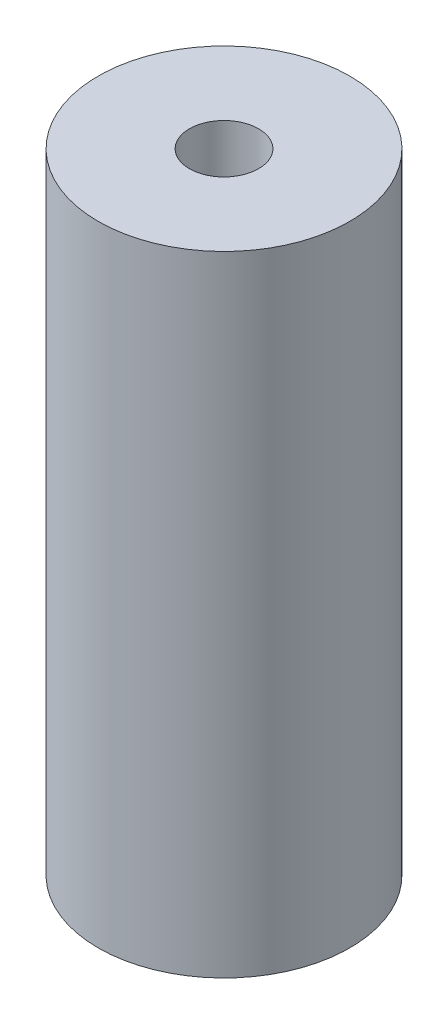
ISO-10303-21;
HEADER;
FILE_DESCRIPTION(('STEP AP214'),'2;1');
FILE_NAME('part.step','',(''),(''),'','','');
FILE_SCHEMA(('AUTOMOTIVE_DESIGN { 1 0 10303 214 1 1 1 1 }'));
ENDSEC;
DATA;
#1=APPLICATION_CONTEXT('core data for automotive mechanical design processes');
#2=APPLICATION_PROTOCOL_DEFINITION('international standard','automotive_design',2000,#1);
#3=PRODUCT_CONTEXT('',#1,'mechanical');
#4=PRODUCT('Part','Part','',(#3));
#5=PRODUCT_RELATED_PRODUCT_CATEGORY('part','',(#4));
#6=PRODUCT_DEFINITION_FORMATION('','',#4);
#7=PRODUCT_DEFINITION_CONTEXT('part definition',#1,'design');
#8=PRODUCT_DEFINITION('design','',#6,#7);
#9=PRODUCT_DEFINITION_SHAPE('','',#8);
#10=(LENGTH_UNIT() NAMED_UNIT(*) SI_UNIT(.MILLI.,.METRE.));
#11=(NAMED_UNIT(*) PLANE_ANGLE_UNIT() SI_UNIT($,.RADIAN.));
#12=(NAMED_UNIT(*) SI_UNIT($,.STERADIAN.) SOLID_ANGLE_UNIT());
#13=UNCERTAINTY_MEASURE_WITH_UNIT(LENGTH_MEASURE(1.E-05),#10,'distance_accuracy_value','');
#14=(GEOMETRIC_REPRESENTATION_CONTEXT(3) GLOBAL_UNCERTAINTY_ASSIGNED_CONTEXT((#13)) GLOBAL_UNIT_ASSIGNED_CONTEXT((#10,
#11,#12)) REPRESENTATION_CONTEXT('',''));
#15=CARTESIAN_POINT('',(0.,0.,0.));
#16=DIRECTION('',(0.,0.,1.));
#17=DIRECTION('',(1.,0.,0.));
#18=AXIS2_PLACEMENT_3D('',#15,#16,#17);
#19=CARTESIAN_POINT('',(0.,30.,0.));
#20=DIRECTION('',(0.,-1.,0.));
#21=DIRECTION('',(0.,0.,-1.));
#22=AXIS2_PLACEMENT_3D('',#19,#20,#21);
#23=CYLINDRICAL_SURFACE('',#22,6.);
#24=CARTESIAN_POINT('',(0.,30.,0.));
#25=DIRECTION('',(0.,1.,0.));
#26=DIRECTION('',(0.,0.,1.));
#27=AXIS2_PLACEMENT_3D('',#24,#25,#26);
#28=CIRCLE('',#27,6.);
#29=CARTESIAN_POINT('',(0.,30.,6.));
#30=VERTEX_POINT('',#29);
#31=EDGE_CURVE('E10',#30,#30,#28,.T.);
#32=ORIENTED_EDGE('',*,*,#31,.F.);
#33=EDGE_LOOP('',(#32));
#34=FACE_BOUND('',#33,.T.);
#35=CARTESIAN_POINT('',(0.,0.,0.));
#36=DIRECTION('',(0.,1.,0.));
#37=DIRECTION('',(0.,0.,1.));
#38=AXIS2_PLACEMENT_3D('',#35,#36,#37);
#39=CIRCLE('',#38,6.);
#40=CARTESIAN_POINT('',(0.,0.,6.));
#41=VERTEX_POINT('',#40);
#42=EDGE_CURVE('E46',#41,#41,#39,.T.);
#43=ORIENTED_EDGE('',*,*,#42,.T.);
#44=EDGE_LOOP('',(#43));
#45=FACE_BOUND('',#44,.T.);
#46=ADVANCED_FACE('F43',(#34,#45),#23,.T.);
#47=CARTESIAN_POINT('',(0.,30.,0.));
#48=DIRECTION('',(0.,1.,0.));
#49=DIRECTION('',(0.,0.,1.));
#50=AXIS2_PLACEMENT_3D('',#47,#48,#49);
#51=PLANE('',#50);
#52=CARTESIAN_POINT('',(0.,30.,0.));
#53=DIRECTION('',(0.,-1.,0.));
#54=DIRECTION('',(0.,0.,-1.));
#55=AXIS2_PLACEMENT_3D('',#52,#53,#54);
#56=CIRCLE('',#55,1.64999999999999);
#57=CARTESIAN_POINT('',(0.,30.,-1.64999999999999));
#58=VERTEX_POINT('',#57);
#59=EDGE_CURVE('E53',#58,#58,#56,.T.);
#60=ORIENTED_EDGE('',*,*,#59,.T.);
#61=EDGE_LOOP('',(#60));
#62=FACE_BOUND('',#61,.T.);
#63=ORIENTED_EDGE('',*,*,#31,.T.);
#64=EDGE_LOOP('',(#63));
#65=FACE_BOUND('',#64,.T.);
#66=ADVANCED_FACE('F70',(#62,#65),#51,.T.);
#67=CARTESIAN_POINT('',(0.,0.,0.));
#68=DIRECTION('',(0.,1.,0.));
#69=DIRECTION('',(0.,0.,1.));
#70=AXIS2_PLACEMENT_3D('',#67,#68,#69);
#71=PLANE('',#70);
#72=CARTESIAN_POINT('',(0.,0.,0.));
#73=DIRECTION('',(0.,-1.,0.));
#74=DIRECTION('',(0.,0.,-1.));
#75=AXIS2_PLACEMENT_3D('',#72,#73,#74);
#76=CIRCLE('',#75,2.025);
#77=CARTESIAN_POINT('',(0.,0.,-2.025));
#78=VERTEX_POINT('',#77);
#79=EDGE_CURVE('E60',#78,#78,#76,.T.);
#80=ORIENTED_EDGE('',*,*,#79,.F.);
#81=EDGE_LOOP('',(#80));
#82=FACE_BOUND('',#81,.T.);
#83=ORIENTED_EDGE('',*,*,#42,.F.);
#84=EDGE_LOOP('',(#83));
#85=FACE_BOUND('',#84,.T.);
#86=ADVANCED_FACE('F66',(#82,#85),#71,.F.);
#87=CARTESIAN_POINT('',(0.,0.,0.));
#88=DIRECTION('',(0.,-1.,0.));
#89=DIRECTION('',(0.,0.,-1.));
#90=AXIS2_PLACEMENT_3D('',#87,#88,#89);
#91=CYLINDRICAL_SURFACE('',#90,1.65);
#92=ORIENTED_EDGE('',*,*,#59,.F.);
#93=EDGE_LOOP('',(#92));
#94=FACE_BOUND('',#93,.T.);
#95=CARTESIAN_POINT('',(0.,0.375,0.));
#96=DIRECTION('',(0.,-1.,0.));
#97=DIRECTION('',(0.,0.,-1.));
#98=AXIS2_PLACEMENT_3D('',#95,#96,#97);
#99=CIRCLE('',#98,1.65);
#100=CARTESIAN_POINT('',(0.,0.375,-1.65));
#101=VERTEX_POINT('',#100);
#102=EDGE_CURVE('E57',#101,#101,#99,.T.);
#103=ORIENTED_EDGE('',*,*,#102,.T.);
#104=EDGE_LOOP('',(#103));
#105=FACE_BOUND('',#104,.T.);
#106=ADVANCED_FACE('F69',(#94,#105),#91,.F.);
#107=CARTESIAN_POINT('',(0.,0.,0.));
#108=DIRECTION('',(0.,-1.,0.));
#109=DIRECTION('',(0.,0.,-1.));
#110=AXIS2_PLACEMENT_3D('',#107,#108,#109);
#111=CONICAL_SURFACE('',#110,2.025,0.785398163397446);
#112=ORIENTED_EDGE('',*,*,#102,.F.);
#113=EDGE_LOOP('',(#112));
#114=FACE_BOUND('',#113,.T.);
#115=ORIENTED_EDGE('',*,*,#79,.T.);
#116=EDGE_LOOP('',(#115));
#117=FACE_BOUND('',#116,.T.);
#118=ADVANCED_FACE('F64',(#114,#117),#111,.F.);
#119=CLOSED_SHELL('',(#46,#66,#86,#106,#118));
#120=MANIFOLD_SOLID_BREP('B2',#119);
#121=ADVANCED_BREP_SHAPE_REPRESENTATION('',(#18,#120),#14);
#122=SHAPE_DEFINITION_REPRESENTATION(#9,#121);
ENDSEC;
END-ISO-10303-21;
